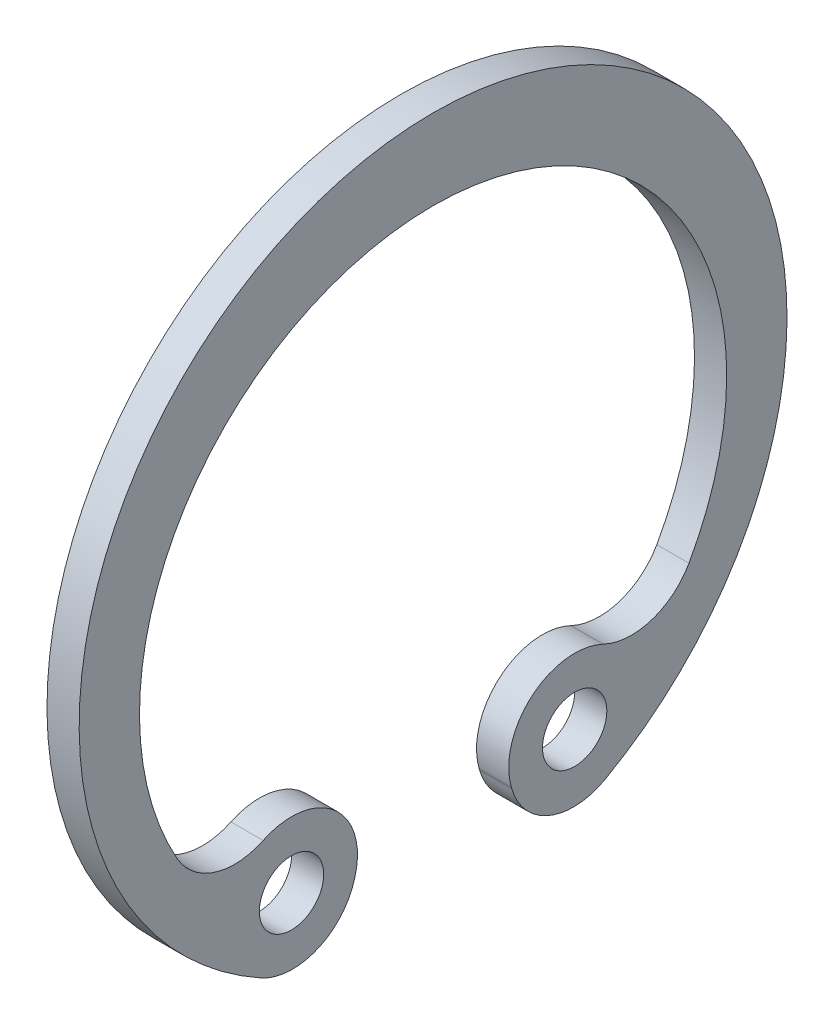
ISO-10303-21;
HEADER;
FILE_DESCRIPTION(('STEP AP214'),'2;1');
FILE_NAME('part.step','',(''),(''),'','','');
FILE_SCHEMA(('AUTOMOTIVE_DESIGN { 1 0 10303 214 1 1 1 1 }'));
ENDSEC;
DATA;
#1=APPLICATION_CONTEXT('core data for automotive mechanical design processes');
#2=APPLICATION_PROTOCOL_DEFINITION('international standard','automotive_design',2000,#1);
#3=PRODUCT_CONTEXT('',#1,'mechanical');
#4=PRODUCT('Part','Part','',(#3));
#5=PRODUCT_RELATED_PRODUCT_CATEGORY('part','',(#4));
#6=PRODUCT_DEFINITION_FORMATION('','',#4);
#7=PRODUCT_DEFINITION_CONTEXT('part definition',#1,'design');
#8=PRODUCT_DEFINITION('design','',#6,#7);
#9=PRODUCT_DEFINITION_SHAPE('','',#8);
#10=(LENGTH_UNIT() NAMED_UNIT(*) SI_UNIT(.MILLI.,.METRE.));
#11=(NAMED_UNIT(*) PLANE_ANGLE_UNIT() SI_UNIT($,.RADIAN.));
#12=(NAMED_UNIT(*) SI_UNIT($,.STERADIAN.) SOLID_ANGLE_UNIT());
#13=UNCERTAINTY_MEASURE_WITH_UNIT(LENGTH_MEASURE(1.E-05),#10,'distance_accuracy_value','');
#14=(GEOMETRIC_REPRESENTATION_CONTEXT(3) GLOBAL_UNCERTAINTY_ASSIGNED_CONTEXT((#13)) GLOBAL_UNIT_ASSIGNED_CONTEXT((#10,
#11,#12)) REPRESENTATION_CONTEXT('',''));
#15=CARTESIAN_POINT('',(0.,0.,0.));
#16=DIRECTION('',(0.,0.,1.));
#17=DIRECTION('',(1.,0.,0.));
#18=AXIS2_PLACEMENT_3D('',#15,#16,#17);
#19=CARTESIAN_POINT('',(0.5,-7.86810632126544,-4.36954264394585));
#20=DIRECTION('',(1.,0.,0.));
#21=DIRECTION('',(0.,0.,-1.));
#22=AXIS2_PLACEMENT_3D('',#19,#20,#21);
#23=PLANE('',#22);
#24=CARTESIAN_POINT('',(0.5,-7.79374749398516,-4.39999999999997));
#25=DIRECTION('',(1.,0.,0.));
#26=DIRECTION('',(0.,0.,-1.));
#27=AXIS2_PLACEMENT_3D('',#24,#25,#26);
#28=CIRCLE('',#27,1.00000000000003);
#29=CARTESIAN_POINT('',(0.5,-7.79374749398516,-5.4));
#30=VERTEX_POINT('',#29);
#31=EDGE_CURVE('E160',#30,#30,#28,.T.);
#32=ORIENTED_EDGE('',*,*,#31,.F.);
#33=EDGE_LOOP('',(#32));
#34=FACE_BOUND('',#33,.T.);
#35=CARTESIAN_POINT('',(0.5,-7.86810632126544,-4.36954264394585));
#36=DIRECTION('',(1.,0.,0.));
#37=DIRECTION('',(0.,0.,-1.));
#38=AXIS2_PLACEMENT_3D('',#35,#36,#37);
#39=CIRCLE('',#38,2.00000000000007);
#40=CARTESIAN_POINT('',(0.5,-8.4262882582355,-2.4490133092986));
#41=VERTEX_POINT('',#40);
#42=CARTESIAN_POINT('',(0.5,-9.6165743926579,-5.3405521203782));
#43=VERTEX_POINT('',#42);
#44=EDGE_CURVE('E163',#41,#43,#39,.T.);
#45=ORIENTED_EDGE('',*,*,#44,.T.);
#46=CARTESIAN_POINT('',(0.5,0.,0.));
#47=DIRECTION('',(1.,0.,0.));
#48=DIRECTION('',(0.,0.,-1.));
#49=AXIS2_PLACEMENT_3D('',#46,#47,#48);
#50=CIRCLE('',#49,11.);
#51=CARTESIAN_POINT('',(0.5,-9.6165743926579,5.34055212037821));
#52=VERTEX_POINT('',#51);
#53=EDGE_CURVE('E113',#43,#52,#50,.T.);
#54=ORIENTED_EDGE('',*,*,#53,.T.);
#55=CARTESIAN_POINT('',(0.5,-7.86810632126541,4.36954264394585));
#56=DIRECTION('',(1.,0.,0.));
#57=DIRECTION('',(0.,0.,-1.));
#58=AXIS2_PLACEMENT_3D('',#55,#56,#57);
#59=CIRCLE('',#58,2.0000000000001);
#60=CARTESIAN_POINT('',(0.5,-8.4262882582356,2.4490133092986));
#61=VERTEX_POINT('',#60);
#62=EDGE_CURVE('E166',#52,#61,#59,.T.);
#63=ORIENTED_EDGE('',*,*,#62,.T.);
#64=DIRECTION('',(0.,0.960264667323747,-0.279090968484494));
#65=VECTOR('',#64,1.);
#66=CARTESIAN_POINT('',(0.5,-8.4262882582356,2.4490133092986));
#67=LINE('',#66,#65);
#68=CARTESIAN_POINT('',(0.5,-8.3658839793794,2.4314574319866));
#69=VERTEX_POINT('',#68);
#70=EDGE_CURVE('E168',#61,#69,#67,.T.);
#71=ORIENTED_EDGE('',*,*,#70,.T.);
#72=CARTESIAN_POINT('',(0.5,-7.79374749398516,4.39999999999997));
#73=DIRECTION('',(1.,0.,0.));
#74=DIRECTION('',(0.,0.,-1.));
#75=AXIS2_PLACEMENT_3D('',#72,#73,#74);
#76=CIRCLE('',#75,2.04999999999999);
#77=CARTESIAN_POINT('',(0.5,-5.9437401200973,5.2831606402917));
#78=VERTEX_POINT('',#77);
#79=EDGE_CURVE('E170',#69,#78,#76,.T.);
#80=ORIENTED_EDGE('',*,*,#79,.T.);
#81=CARTESIAN_POINT('',(0.5,-4.09373274620942,6.16632128058331));
#82=DIRECTION('',(-1.,0.,0.));
#83=DIRECTION('',(0.,0.,1.));
#84=AXIS2_PLACEMENT_3D('',#81,#82,#83);
#85=CIRCLE('',#84,2.04999999999996);
#86=CARTESIAN_POINT('',(0.5,-5.0988072521781,7.9530292134732));
#87=VERTEX_POINT('',#86);
#88=EDGE_CURVE('E172',#78,#87,#85,.T.);
#89=ORIENTED_EDGE('',*,*,#88,.T.);
#90=CARTESIAN_POINT('',(0.5,-0.624999999999981,0.));
#91=DIRECTION('',(-1.,0.,0.));
#92=DIRECTION('',(0.,0.,1.));
#93=AXIS2_PLACEMENT_3D('',#90,#91,#92);
#94=CIRCLE('',#93,9.12499999999998);
#95=CARTESIAN_POINT('',(0.5,-5.0988072521781,-7.9530292134732));
#96=VERTEX_POINT('',#95);
#97=EDGE_CURVE('E174',#87,#96,#94,.T.);
#98=ORIENTED_EDGE('',*,*,#97,.T.);
#99=CARTESIAN_POINT('',(0.5,-4.09373274620942,-6.16632128058331));
#100=DIRECTION('',(-1.,0.,0.));
#101=DIRECTION('',(0.,0.,1.));
#102=AXIS2_PLACEMENT_3D('',#99,#100,#101);
#103=CIRCLE('',#102,2.04999999999996);
#104=CARTESIAN_POINT('',(0.5,-5.9437401200973,-5.2831606402917));
#105=VERTEX_POINT('',#104);
#106=EDGE_CURVE('E176',#96,#105,#103,.T.);
#107=ORIENTED_EDGE('',*,*,#106,.T.);
#108=CARTESIAN_POINT('',(0.5,-7.79374749398516,-4.39999999999997));
#109=DIRECTION('',(1.,0.,0.));
#110=DIRECTION('',(0.,0.,-1.));
#111=AXIS2_PLACEMENT_3D('',#108,#109,#110);
#112=CIRCLE('',#111,2.04999999999999);
#113=CARTESIAN_POINT('',(0.5,-8.3658839793794,-2.4314574319866));
#114=VERTEX_POINT('',#113);
#115=EDGE_CURVE('E53',#105,#114,#112,.T.);
#116=ORIENTED_EDGE('',*,*,#115,.T.);
#117=DIRECTION('',(0.,-0.960264667323622,-0.279090968484923));
#118=VECTOR('',#117,1.);
#119=CARTESIAN_POINT('',(0.5,-8.3658839793794,-2.4314574319866));
#120=LINE('',#119,#118);
#121=EDGE_CURVE('E48',#114,#41,#120,.T.);
#122=ORIENTED_EDGE('',*,*,#121,.T.);
#123=EDGE_LOOP('',(#45,#54,#63,#71,#80,#89,#98,#107,#116,#122));
#124=FACE_BOUND('',#123,.T.);
#125=CARTESIAN_POINT('',(0.5,-7.79374749398516,4.39999999999997));
#126=DIRECTION('',(1.,0.,0.));
#127=DIRECTION('',(0.,0.,-1.));
#128=AXIS2_PLACEMENT_3D('',#125,#126,#127);
#129=CIRCLE('',#128,0.999999999999968);
#130=CARTESIAN_POINT('',(0.5,-7.79374749398516,3.4));
#131=VERTEX_POINT('',#130);
#132=EDGE_CURVE('E157',#131,#131,#129,.T.);
#133=ORIENTED_EDGE('',*,*,#132,.F.);
#134=EDGE_LOOP('',(#133));
#135=FACE_BOUND('',#134,.T.);
#136=ADVANCED_FACE('F33',(#34,#124,#135),#23,.T.);
#137=CARTESIAN_POINT('',(0.5,-7.86810632126544,-4.36954264394585));
#138=DIRECTION('',(-1.,0.,0.));
#139=DIRECTION('',(0.,0.,1.));
#140=AXIS2_PLACEMENT_3D('',#137,#138,#139);
#141=CYLINDRICAL_SURFACE('',#140,2.00000000000007);
#142=DIRECTION('',(-1.,0.,0.));
#143=VECTOR('',#142,1.);
#144=CARTESIAN_POINT('',(0.5,-8.4262882582355,-2.4490133092986));
#145=LINE('',#144,#143);
#146=CARTESIAN_POINT('',(-0.5,-8.4262882582355,-2.4490133092986));
#147=VERTEX_POINT('',#146);
#148=EDGE_CURVE('E128',#41,#147,#145,.T.);
#149=ORIENTED_EDGE('',*,*,#148,.T.);
#150=CARTESIAN_POINT('',(-0.5,-7.86810632126544,-4.36954264394585));
#151=DIRECTION('',(1.,0.,0.));
#152=DIRECTION('',(0.,0.,-1.));
#153=AXIS2_PLACEMENT_3D('',#150,#151,#152);
#154=CIRCLE('',#153,2.00000000000007);
#155=CARTESIAN_POINT('',(-0.5,-9.6165743926579,-5.3405521203782));
#156=VERTEX_POINT('',#155);
#157=EDGE_CURVE('E122',#147,#156,#154,.T.);
#158=ORIENTED_EDGE('',*,*,#157,.T.);
#159=DIRECTION('',(-1.,0.,0.));
#160=VECTOR('',#159,1.);
#161=CARTESIAN_POINT('',(0.5,-9.6165743926579,-5.3405521203782));
#162=LINE('',#161,#160);
#163=EDGE_CURVE('E11',#43,#156,#162,.T.);
#164=ORIENTED_EDGE('',*,*,#163,.F.);
#165=ORIENTED_EDGE('',*,*,#44,.F.);
#166=EDGE_LOOP('',(#149,#158,#164,#165));
#167=FACE_BOUND('',#166,.T.);
#168=ADVANCED_FACE('F35',(#167),#141,.T.);
#169=CARTESIAN_POINT('',(0.5,0.,0.));
#170=DIRECTION('',(-1.,0.,0.));
#171=DIRECTION('',(0.,0.,1.));
#172=AXIS2_PLACEMENT_3D('',#169,#170,#171);
#173=CYLINDRICAL_SURFACE('',#172,11.);
#174=ORIENTED_EDGE('',*,*,#163,.T.);
#175=CARTESIAN_POINT('',(-0.5,0.,0.));
#176=DIRECTION('',(1.,0.,0.));
#177=DIRECTION('',(0.,0.,-1.));
#178=AXIS2_PLACEMENT_3D('',#175,#176,#177);
#179=CIRCLE('',#178,11.);
#180=CARTESIAN_POINT('',(-0.5,-9.6165743926579,5.34055212037821));
#181=VERTEX_POINT('',#180);
#182=EDGE_CURVE('E112',#156,#181,#179,.T.);
#183=ORIENTED_EDGE('',*,*,#182,.T.);
#184=DIRECTION('',(-1.,0.,0.));
#185=VECTOR('',#184,1.);
#186=CARTESIAN_POINT('',(0.5,-9.6165743926579,5.34055212037821));
#187=LINE('',#186,#185);
#188=EDGE_CURVE('E41',#52,#181,#187,.T.);
#189=ORIENTED_EDGE('',*,*,#188,.F.);
#190=ORIENTED_EDGE('',*,*,#53,.F.);
#191=EDGE_LOOP('',(#174,#183,#189,#190));
#192=FACE_BOUND('',#191,.T.);
#193=ADVANCED_FACE('F110',(#192),#173,.T.);
#194=CARTESIAN_POINT('',(0.5,-7.86810632126541,4.36954264394585));
#195=DIRECTION('',(-1.,0.,0.));
#196=DIRECTION('',(0.,0.,1.));
#197=AXIS2_PLACEMENT_3D('',#194,#195,#196);
#198=CYLINDRICAL_SURFACE('',#197,2.0000000000001);
#199=ORIENTED_EDGE('',*,*,#188,.T.);
#200=CARTESIAN_POINT('',(-0.5,-7.86810632126541,4.36954264394585));
#201=DIRECTION('',(1.,0.,0.));
#202=DIRECTION('',(0.,0.,-1.));
#203=AXIS2_PLACEMENT_3D('',#200,#201,#202);
#204=CIRCLE('',#203,2.0000000000001);
#205=CARTESIAN_POINT('',(-0.5,-8.4262882582356,2.4490133092986));
#206=VERTEX_POINT('',#205);
#207=EDGE_CURVE('E126',#181,#206,#204,.T.);
#208=ORIENTED_EDGE('',*,*,#207,.T.);
#209=DIRECTION('',(-1.,0.,0.));
#210=VECTOR('',#209,1.);
#211=CARTESIAN_POINT('',(0.5,-8.4262882582356,2.4490133092986));
#212=LINE('',#211,#210);
#213=EDGE_CURVE('E193',#61,#206,#212,.T.);
#214=ORIENTED_EDGE('',*,*,#213,.F.);
#215=ORIENTED_EDGE('',*,*,#62,.F.);
#216=EDGE_LOOP('',(#199,#208,#214,#215));
#217=FACE_BOUND('',#216,.T.);
#218=ADVANCED_FACE('F196',(#217),#198,.T.);
#219=CARTESIAN_POINT('',(0.5,-8.4262882582356,2.4490133092986));
#220=DIRECTION('',(0.,0.279090968484494,0.960264667323747));
#221=DIRECTION('',(0.,-0.960264667323747,0.279090968484494));
#222=AXIS2_PLACEMENT_3D('',#219,#220,#221);
#223=PLANE('',#222);
#224=ORIENTED_EDGE('',*,*,#213,.T.);
#225=DIRECTION('',(0.,0.960264667323747,-0.279090968484494));
#226=VECTOR('',#225,1.);
#227=CARTESIAN_POINT('',(-0.5,-8.4262882582356,2.4490133092986));
#228=LINE('',#227,#226);
#229=CARTESIAN_POINT('',(-0.5,-8.3658839793794,2.4314574319866));
#230=VERTEX_POINT('',#229);
#231=EDGE_CURVE('E137',#206,#230,#228,.T.);
#232=ORIENTED_EDGE('',*,*,#231,.T.);
#233=DIRECTION('',(-1.,0.,0.));
#234=VECTOR('',#233,1.);
#235=CARTESIAN_POINT('',(0.5,-8.3658839793794,2.4314574319866));
#236=LINE('',#235,#234);
#237=EDGE_CURVE('E191',#69,#230,#236,.T.);
#238=ORIENTED_EDGE('',*,*,#237,.F.);
#239=ORIENTED_EDGE('',*,*,#70,.F.);
#240=EDGE_LOOP('',(#224,#232,#238,#239));
#241=FACE_BOUND('',#240,.T.);
#242=ADVANCED_FACE('F204',(#241),#223,.F.);
#243=CARTESIAN_POINT('',(0.5,-7.79374749398516,4.39999999999997));
#244=DIRECTION('',(-1.,0.,0.));
#245=DIRECTION('',(0.,0.,1.));
#246=AXIS2_PLACEMENT_3D('',#243,#244,#245);
#247=CYLINDRICAL_SURFACE('',#246,2.04999999999999);
#248=ORIENTED_EDGE('',*,*,#237,.T.);
#249=CARTESIAN_POINT('',(-0.5,-7.79374749398516,4.39999999999997));
#250=DIRECTION('',(1.,0.,0.));
#251=DIRECTION('',(0.,0.,-1.));
#252=AXIS2_PLACEMENT_3D('',#249,#250,#251);
#253=CIRCLE('',#252,2.04999999999999);
#254=CARTESIAN_POINT('',(-0.5,-5.9437401200973,5.2831606402917));
#255=VERTEX_POINT('',#254);
#256=EDGE_CURVE('E140',#230,#255,#253,.T.);
#257=ORIENTED_EDGE('',*,*,#256,.T.);
#258=DIRECTION('',(-1.,0.,0.));
#259=VECTOR('',#258,1.);
#260=CARTESIAN_POINT('',(0.5,-5.9437401200973,5.2831606402917));
#261=LINE('',#260,#259);
#262=EDGE_CURVE('E189',#78,#255,#261,.T.);
#263=ORIENTED_EDGE('',*,*,#262,.F.);
#264=ORIENTED_EDGE('',*,*,#79,.F.);
#265=EDGE_LOOP('',(#248,#257,#263,#264));
#266=FACE_BOUND('',#265,.T.);
#267=ADVANCED_FACE('F207',(#266),#247,.T.);
#268=CARTESIAN_POINT('',(0.5,-4.09373274620942,6.16632128058331));
#269=DIRECTION('',(-1.,0.,0.));
#270=DIRECTION('',(0.,0.,1.));
#271=AXIS2_PLACEMENT_3D('',#268,#269,#270);
#272=CYLINDRICAL_SURFACE('',#271,2.04999999999996);
#273=ORIENTED_EDGE('',*,*,#262,.T.);
#274=CARTESIAN_POINT('',(-0.5,-4.09373274620942,6.16632128058331));
#275=DIRECTION('',(-1.,0.,0.));
#276=DIRECTION('',(0.,0.,1.));
#277=AXIS2_PLACEMENT_3D('',#274,#275,#276);
#278=CIRCLE('',#277,2.04999999999996);
#279=CARTESIAN_POINT('',(-0.5,-5.0988072521781,7.9530292134732));
#280=VERTEX_POINT('',#279);
#281=EDGE_CURVE('E143',#255,#280,#278,.T.);
#282=ORIENTED_EDGE('',*,*,#281,.T.);
#283=DIRECTION('',(-1.,0.,0.));
#284=VECTOR('',#283,1.);
#285=CARTESIAN_POINT('',(0.5,-5.0988072521781,7.9530292134732));
#286=LINE('',#285,#284);
#287=EDGE_CURVE('E187',#87,#280,#286,.T.);
#288=ORIENTED_EDGE('',*,*,#287,.F.);
#289=ORIENTED_EDGE('',*,*,#88,.F.);
#290=EDGE_LOOP('',(#273,#282,#288,#289));
#291=FACE_BOUND('',#290,.T.);
#292=ADVANCED_FACE('F212',(#291),#272,.F.);
#293=CARTESIAN_POINT('',(0.5,-0.624999999999981,0.));
#294=DIRECTION('',(-1.,0.,0.));
#295=DIRECTION('',(0.,0.,1.));
#296=AXIS2_PLACEMENT_3D('',#293,#294,#295);
#297=CYLINDRICAL_SURFACE('',#296,9.12499999999998);
#298=ORIENTED_EDGE('',*,*,#287,.T.);
#299=CARTESIAN_POINT('',(-0.5,-0.624999999999981,0.));
#300=DIRECTION('',(-1.,0.,0.));
#301=DIRECTION('',(0.,0.,1.));
#302=AXIS2_PLACEMENT_3D('',#299,#300,#301);
#303=CIRCLE('',#302,9.12499999999998);
#304=CARTESIAN_POINT('',(-0.5,-5.0988072521781,-7.9530292134732));
#305=VERTEX_POINT('',#304);
#306=EDGE_CURVE('E146',#280,#305,#303,.T.);
#307=ORIENTED_EDGE('',*,*,#306,.T.);
#308=DIRECTION('',(-1.,0.,0.));
#309=VECTOR('',#308,1.);
#310=CARTESIAN_POINT('',(0.5,-5.0988072521781,-7.9530292134732));
#311=LINE('',#310,#309);
#312=EDGE_CURVE('E185',#96,#305,#311,.T.);
#313=ORIENTED_EDGE('',*,*,#312,.F.);
#314=ORIENTED_EDGE('',*,*,#97,.F.);
#315=EDGE_LOOP('',(#298,#307,#313,#314));
#316=FACE_BOUND('',#315,.T.);
#317=ADVANCED_FACE('F218',(#316),#297,.F.);
#318=CARTESIAN_POINT('',(0.5,-4.09373274620942,-6.16632128058331));
#319=DIRECTION('',(-1.,0.,0.));
#320=DIRECTION('',(0.,0.,1.));
#321=AXIS2_PLACEMENT_3D('',#318,#319,#320);
#322=CYLINDRICAL_SURFACE('',#321,2.04999999999996);
#323=ORIENTED_EDGE('',*,*,#312,.T.);
#324=CARTESIAN_POINT('',(-0.5,-4.09373274620942,-6.16632128058331));
#325=DIRECTION('',(-1.,0.,0.));
#326=DIRECTION('',(0.,0.,1.));
#327=AXIS2_PLACEMENT_3D('',#324,#325,#326);
#328=CIRCLE('',#327,2.04999999999996);
#329=CARTESIAN_POINT('',(-0.5,-5.9437401200973,-5.2831606402917));
#330=VERTEX_POINT('',#329);
#331=EDGE_CURVE('E149',#305,#330,#328,.T.);
#332=ORIENTED_EDGE('',*,*,#331,.T.);
#333=DIRECTION('',(-1.,0.,0.));
#334=VECTOR('',#333,1.);
#335=CARTESIAN_POINT('',(0.5,-5.9437401200973,-5.2831606402917));
#336=LINE('',#335,#334);
#337=EDGE_CURVE('E183',#105,#330,#336,.T.);
#338=ORIENTED_EDGE('',*,*,#337,.F.);
#339=ORIENTED_EDGE('',*,*,#106,.F.);
#340=EDGE_LOOP('',(#323,#332,#338,#339));
#341=FACE_BOUND('',#340,.T.);
#342=ADVANCED_FACE('F222',(#341),#322,.F.);
#343=CARTESIAN_POINT('',(0.5,-7.79374749398516,-4.39999999999997));
#344=DIRECTION('',(-1.,0.,0.));
#345=DIRECTION('',(0.,0.,1.));
#346=AXIS2_PLACEMENT_3D('',#343,#344,#345);
#347=CYLINDRICAL_SURFACE('',#346,2.04999999999999);
#348=ORIENTED_EDGE('',*,*,#337,.T.);
#349=CARTESIAN_POINT('',(-0.5,-7.79374749398516,-4.39999999999997));
#350=DIRECTION('',(1.,0.,0.));
#351=DIRECTION('',(0.,0.,-1.));
#352=AXIS2_PLACEMENT_3D('',#349,#350,#351);
#353=CIRCLE('',#352,2.04999999999999);
#354=CARTESIAN_POINT('',(-0.5,-8.3658839793794,-2.4314574319866));
#355=VERTEX_POINT('',#354);
#356=EDGE_CURVE('E152',#330,#355,#353,.T.);
#357=ORIENTED_EDGE('',*,*,#356,.T.);
#358=DIRECTION('',(-1.,0.,0.));
#359=VECTOR('',#358,1.);
#360=CARTESIAN_POINT('',(0.5,-8.3658839793794,-2.4314574319866));
#361=LINE('',#360,#359);
#362=EDGE_CURVE('E181',#114,#355,#361,.T.);
#363=ORIENTED_EDGE('',*,*,#362,.F.);
#364=ORIENTED_EDGE('',*,*,#115,.F.);
#365=EDGE_LOOP('',(#348,#357,#363,#364));
#366=FACE_BOUND('',#365,.T.);
#367=ADVANCED_FACE('F225',(#366),#347,.T.);
#368=CARTESIAN_POINT('',(0.5,-8.3658839793794,-2.4314574319866));
#369=DIRECTION('',(0.,0.279090968484923,-0.960264667323623));
#370=DIRECTION('',(0.,0.960264667323623,0.279090968484923));
#371=AXIS2_PLACEMENT_3D('',#368,#369,#370);
#372=PLANE('',#371);
#373=ORIENTED_EDGE('',*,*,#362,.T.);
#374=DIRECTION('',(0.,-0.960264667323622,-0.279090968484923));
#375=VECTOR('',#374,1.);
#376=CARTESIAN_POINT('',(-0.5,-8.3658839793794,-2.4314574319866));
#377=LINE('',#376,#375);
#378=EDGE_CURVE('E155',#355,#147,#377,.T.);
#379=ORIENTED_EDGE('',*,*,#378,.T.);
#380=ORIENTED_EDGE('',*,*,#148,.F.);
#381=ORIENTED_EDGE('',*,*,#121,.F.);
#382=EDGE_LOOP('',(#373,#379,#380,#381));
#383=FACE_BOUND('',#382,.T.);
#384=ADVANCED_FACE('F227',(#383),#372,.F.);
#385=CARTESIAN_POINT('',(0.5,-7.79374749398516,-4.39999999999997));
#386=DIRECTION('',(-1.,0.,0.));
#387=DIRECTION('',(0.,0.,1.));
#388=AXIS2_PLACEMENT_3D('',#385,#386,#387);
#389=CYLINDRICAL_SURFACE('',#388,1.00000000000003);
#390=ORIENTED_EDGE('',*,*,#31,.T.);
#391=EDGE_LOOP('',(#390));
#392=FACE_BOUND('',#391,.T.);
#393=CARTESIAN_POINT('',(-0.5,-7.79374749398516,-4.39999999999997));
#394=DIRECTION('',(1.,0.,0.));
#395=DIRECTION('',(0.,0.,-1.));
#396=AXIS2_PLACEMENT_3D('',#393,#394,#395);
#397=CIRCLE('',#396,1.00000000000003);
#398=CARTESIAN_POINT('',(-0.5,-7.79374749398516,-5.4));
#399=VERTEX_POINT('',#398);
#400=EDGE_CURVE('E129',#399,#399,#397,.T.);
#401=ORIENTED_EDGE('',*,*,#400,.F.);
#402=EDGE_LOOP('',(#401));
#403=FACE_BOUND('',#402,.T.);
#404=ADVANCED_FACE('F229',(#392,#403),#389,.F.);
#405=CARTESIAN_POINT('',(0.5,-7.79374749398516,4.39999999999997));
#406=DIRECTION('',(-1.,0.,0.));
#407=DIRECTION('',(0.,0.,1.));
#408=AXIS2_PLACEMENT_3D('',#405,#406,#407);
#409=CYLINDRICAL_SURFACE('',#408,0.999999999999968);
#410=ORIENTED_EDGE('',*,*,#132,.T.);
#411=EDGE_LOOP('',(#410));
#412=FACE_BOUND('',#411,.T.);
#413=CARTESIAN_POINT('',(-0.5,-7.79374749398516,4.39999999999997));
#414=DIRECTION('',(1.,0.,0.));
#415=DIRECTION('',(0.,0.,-1.));
#416=AXIS2_PLACEMENT_3D('',#413,#414,#415);
#417=CIRCLE('',#416,0.999999999999968);
#418=CARTESIAN_POINT('',(-0.5,-7.79374749398516,3.4));
#419=VERTEX_POINT('',#418);
#420=EDGE_CURVE('E132',#419,#419,#417,.T.);
#421=ORIENTED_EDGE('',*,*,#420,.F.);
#422=EDGE_LOOP('',(#421));
#423=FACE_BOUND('',#422,.T.);
#424=ADVANCED_FACE('F235',(#412,#423),#409,.F.);
#425=CARTESIAN_POINT('',(-0.5,-7.86810632126544,-4.36954264394585));
#426=DIRECTION('',(1.,0.,0.));
#427=DIRECTION('',(0.,0.,-1.));
#428=AXIS2_PLACEMENT_3D('',#425,#426,#427);
#429=PLANE('',#428);
#430=ORIENTED_EDGE('',*,*,#420,.T.);
#431=EDGE_LOOP('',(#430));
#432=FACE_BOUND('',#431,.T.);
#433=ORIENTED_EDGE('',*,*,#400,.T.);
#434=EDGE_LOOP('',(#433));
#435=FACE_BOUND('',#434,.T.);
#436=ORIENTED_EDGE('',*,*,#157,.F.);
#437=ORIENTED_EDGE('',*,*,#378,.F.);
#438=ORIENTED_EDGE('',*,*,#356,.F.);
#439=ORIENTED_EDGE('',*,*,#331,.F.);
#440=ORIENTED_EDGE('',*,*,#306,.F.);
#441=ORIENTED_EDGE('',*,*,#281,.F.);
#442=ORIENTED_EDGE('',*,*,#256,.F.);
#443=ORIENTED_EDGE('',*,*,#231,.F.);
#444=ORIENTED_EDGE('',*,*,#207,.F.);
#445=ORIENTED_EDGE('',*,*,#182,.F.);
#446=EDGE_LOOP('',(#436,#437,#438,#439,#440,#441,#442,#443,#444,#445));
#447=FACE_BOUND('',#446,.T.);
#448=ADVANCED_FACE('F120',(#432,#435,#447),#429,.F.);
#449=CLOSED_SHELL('',(#136,#168,#193,#218,#242,#267,#292,#317,#342,#367,#384,#404,#424,#448));
#450=MANIFOLD_SOLID_BREP('B2',#449);
#451=ADVANCED_BREP_SHAPE_REPRESENTATION('',(#18,#450),#14);
#452=SHAPE_DEFINITION_REPRESENTATION(#9,#451);
ENDSEC;
END-ISO-10303-21;
